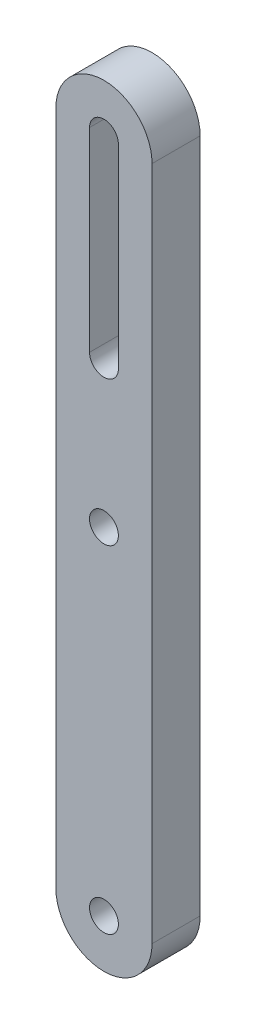
ISO-10303-21;
HEADER;
FILE_DESCRIPTION(('STEP AP214'),'2;1');
FILE_NAME('part.step','',(''),(''),'','','');
FILE_SCHEMA(('AUTOMOTIVE_DESIGN { 1 0 10303 214 1 1 1 1 }'));
ENDSEC;
DATA;
#1=APPLICATION_CONTEXT('core data for automotive mechanical design processes');
#2=APPLICATION_PROTOCOL_DEFINITION('international standard','automotive_design',2000,#1);
#3=PRODUCT_CONTEXT('',#1,'mechanical');
#4=PRODUCT('Part','Part','',(#3));
#5=PRODUCT_RELATED_PRODUCT_CATEGORY('part','',(#4));
#6=PRODUCT_DEFINITION_FORMATION('','',#4);
#7=PRODUCT_DEFINITION_CONTEXT('part definition',#1,'design');
#8=PRODUCT_DEFINITION('design','',#6,#7);
#9=PRODUCT_DEFINITION_SHAPE('','',#8);
#10=(LENGTH_UNIT() NAMED_UNIT(*) SI_UNIT(.MILLI.,.METRE.));
#11=(NAMED_UNIT(*) PLANE_ANGLE_UNIT() SI_UNIT($,.RADIAN.));
#12=(NAMED_UNIT(*) SI_UNIT($,.STERADIAN.) SOLID_ANGLE_UNIT());
#13=UNCERTAINTY_MEASURE_WITH_UNIT(LENGTH_MEASURE(1.E-05),#10,'distance_accuracy_value','');
#14=(GEOMETRIC_REPRESENTATION_CONTEXT(3) GLOBAL_UNCERTAINTY_ASSIGNED_CONTEXT((#13)) GLOBAL_UNIT_ASSIGNED_CONTEXT((#10,
#11,#12)) REPRESENTATION_CONTEXT('',''));
#15=CARTESIAN_POINT('',(0.,0.,0.));
#16=DIRECTION('',(0.,0.,1.));
#17=DIRECTION('',(1.,0.,0.));
#18=AXIS2_PLACEMENT_3D('',#15,#16,#17);
#19=CARTESIAN_POINT('',(0.,0.,5.));
#20=DIRECTION('',(0.,0.,1.));
#21=DIRECTION('',(1.,0.,0.));
#22=AXIS2_PLACEMENT_3D('',#19,#20,#21);
#23=PLANE('',#22);
#24=DIRECTION('',(0.,-1.,0.));
#25=VECTOR('',#24,1.);
#26=CARTESIAN_POINT('',(-1.5,0.,5.));
#27=LINE('',#26,#25);
#28=CARTESIAN_POINT('',(-1.49999909745678,-29.7588302171352,5.));
#29=VERTEX_POINT('',#28);
#30=CARTESIAN_POINT('',(-1.5,-50.,5.));
#31=VERTEX_POINT('',#30);
#32=EDGE_CURVE('E130',#29,#31,#27,.T.);
#33=ORIENTED_EDGE('',*,*,#32,.F.);
#34=CARTESIAN_POINT('',(9.02543215511309E-07,-29.7588302171352,5.));
#35=DIRECTION('',(0.,0.,1.));
#36=DIRECTION('',(-1.,0.,0.));
#37=AXIS2_PLACEMENT_3D('',#34,#35,#36);
#38=CIRCLE('',#37,1.5);
#39=CARTESIAN_POINT('',(1.5,-29.7604757045501,5.));
#40=VERTEX_POINT('',#39);
#41=EDGE_CURVE('E124',#40,#29,#38,.T.);
#42=ORIENTED_EDGE('',*,*,#41,.F.);
#43=DIRECTION('',(0.,1.,0.));
#44=VECTOR('',#43,1.);
#45=CARTESIAN_POINT('',(1.5,0.,5.));
#46=LINE('',#45,#44);
#47=CARTESIAN_POINT('',(1.5,-50.,5.));
#48=VERTEX_POINT('',#47);
#49=EDGE_CURVE('E107',#48,#40,#46,.T.);
#50=ORIENTED_EDGE('',*,*,#49,.F.);
#51=CARTESIAN_POINT('',(0.,-50.,5.));
#52=DIRECTION('',(0.,0.,1.));
#53=DIRECTION('',(1.,0.,0.));
#54=AXIS2_PLACEMENT_3D('',#51,#52,#53);
#55=CIRCLE('',#54,1.5);
#56=EDGE_CURVE('E117',#31,#48,#55,.T.);
#57=ORIENTED_EDGE('',*,*,#56,.F.);
#58=EDGE_LOOP('',(#33,#42,#50,#57));
#59=FACE_BOUND('',#58,.T.);
#60=CARTESIAN_POINT('',(9.02543215511309E-07,-29.7588302171352,5.));
#61=DIRECTION('',(0.,0.,-1.));
#62=DIRECTION('',(-1.,0.,0.));
#63=AXIS2_PLACEMENT_3D('',#60,#61,#62);
#64=CIRCLE('',#63,4.99999936821972);
#65=CARTESIAN_POINT('',(-4.99999846567651,-29.7588302171352,5.));
#66=VERTEX_POINT('',#65);
#67=CARTESIAN_POINT('',(5.00000000000001,-29.7604757045501,5.));
#68=VERTEX_POINT('',#67);
#69=EDGE_CURVE('E135',#66,#68,#64,.T.);
#70=ORIENTED_EDGE('',*,*,#69,.F.);
#71=DIRECTION('',(6.18896317433317E-07,0.999999999999808,0.));
#72=VECTOR('',#71,1.);
#73=CARTESIAN_POINT('',(-4.99999846567651,-29.7588302171352,5.));
#74=LINE('',#73,#72);
#75=CARTESIAN_POINT('',(-4.99999846669489,-29.7604757045506,5.));
#76=VERTEX_POINT('',#75);
#77=EDGE_CURVE('E132',#76,#66,#74,.T.);
#78=ORIENTED_EDGE('',*,*,#77,.F.);
#79=DIRECTION('',(0.,-1.,0.));
#80=VECTOR('',#79,1.);
#81=CARTESIAN_POINT('',(-5.,0.,5.));
#82=LINE('',#81,#80);
#83=CARTESIAN_POINT('',(-4.99999999999999,-100.,5.));
#84=VERTEX_POINT('',#83);
#85=EDGE_CURVE('E171',#76,#84,#82,.T.);
#86=ORIENTED_EDGE('',*,*,#85,.T.);
#87=CARTESIAN_POINT('',(0.,-100.,5.));
#88=DIRECTION('',(0.,0.,1.));
#89=DIRECTION('',(1.,0.,0.));
#90=AXIS2_PLACEMENT_3D('',#87,#88,#89);
#91=CIRCLE('',#90,5.);
#92=CARTESIAN_POINT('',(5.00000000000001,-100.,5.));
#93=VERTEX_POINT('',#92);
#94=EDGE_CURVE('E50',#84,#93,#91,.T.);
#95=ORIENTED_EDGE('',*,*,#94,.T.);
#96=DIRECTION('',(0.,1.,0.));
#97=VECTOR('',#96,1.);
#98=CARTESIAN_POINT('',(5.,0.,5.));
#99=LINE('',#98,#97);
#100=EDGE_CURVE('E175',#93,#68,#99,.T.);
#101=ORIENTED_EDGE('',*,*,#100,.T.);
#102=EDGE_LOOP('',(#70,#78,#86,#95,#101));
#103=FACE_BOUND('',#102,.T.);
#104=CARTESIAN_POINT('',(0.,-100.,5.));
#105=DIRECTION('',(0.,0.,1.));
#106=DIRECTION('',(1.,0.,0.));
#107=AXIS2_PLACEMENT_3D('',#104,#105,#106);
#108=CIRCLE('',#107,1.5);
#109=CARTESIAN_POINT('',(1.50000000000001,-100.,5.));
#110=VERTEX_POINT('',#109);
#111=EDGE_CURVE('E166',#110,#110,#108,.T.);
#112=ORIENTED_EDGE('',*,*,#111,.F.);
#113=EDGE_LOOP('',(#112));
#114=FACE_BOUND('',#113,.T.);
#115=CARTESIAN_POINT('',(0.,-65.,5.));
#116=DIRECTION('',(0.,0.,1.));
#117=DIRECTION('',(1.,0.,0.));
#118=AXIS2_PLACEMENT_3D('',#115,#116,#117);
#119=CIRCLE('',#118,1.5);
#120=CARTESIAN_POINT('',(1.50000000000001,-65.,5.));
#121=VERTEX_POINT('',#120);
#122=EDGE_CURVE('E160',#121,#121,#119,.T.);
#123=ORIENTED_EDGE('',*,*,#122,.F.);
#124=EDGE_LOOP('',(#123));
#125=FACE_BOUND('',#124,.T.);
#126=ADVANCED_FACE('F33',(#59,#103,#114,#125),#23,.T.);
#127=CARTESIAN_POINT('',(0.,0.,0.));
#128=DIRECTION('',(0.,0.,1.));
#129=DIRECTION('',(1.,0.,0.));
#130=AXIS2_PLACEMENT_3D('',#127,#128,#129);
#131=PLANE('',#130);
#132=CARTESIAN_POINT('',(9.02543215511309E-07,-29.7588302171352,0.));
#133=DIRECTION('',(0.,0.,1.));
#134=DIRECTION('',(-1.,0.,0.));
#135=AXIS2_PLACEMENT_3D('',#132,#133,#134);
#136=CIRCLE('',#135,1.5);
#137=CARTESIAN_POINT('',(1.5,-29.7604757045501,0.));
#138=VERTEX_POINT('',#137);
#139=CARTESIAN_POINT('',(-1.49999909745678,-29.7588302171352,0.));
#140=VERTEX_POINT('',#139);
#141=EDGE_CURVE('E126',#138,#140,#136,.T.);
#142=ORIENTED_EDGE('',*,*,#141,.T.);
#143=DIRECTION('',(0.,-1.,0.));
#144=VECTOR('',#143,1.);
#145=CARTESIAN_POINT('',(-1.5,0.,0.));
#146=LINE('',#145,#144);
#147=CARTESIAN_POINT('',(-1.5,-50.,0.));
#148=VERTEX_POINT('',#147);
#149=EDGE_CURVE('E154',#140,#148,#146,.T.);
#150=ORIENTED_EDGE('',*,*,#149,.T.);
#151=CARTESIAN_POINT('',(0.,-50.,0.));
#152=DIRECTION('',(0.,0.,1.));
#153=DIRECTION('',(1.,0.,0.));
#154=AXIS2_PLACEMENT_3D('',#151,#152,#153);
#155=CIRCLE('',#154,1.5);
#156=CARTESIAN_POINT('',(1.5,-50.,0.));
#157=VERTEX_POINT('',#156);
#158=EDGE_CURVE('E11',#148,#157,#155,.T.);
#159=ORIENTED_EDGE('',*,*,#158,.T.);
#160=DIRECTION('',(0.,1.,0.));
#161=VECTOR('',#160,1.);
#162=CARTESIAN_POINT('',(1.5,0.,0.));
#163=LINE('',#162,#161);
#164=EDGE_CURVE('E70',#157,#138,#163,.T.);
#165=ORIENTED_EDGE('',*,*,#164,.T.);
#166=EDGE_LOOP('',(#142,#150,#159,#165));
#167=FACE_BOUND('',#166,.T.);
#168=CARTESIAN_POINT('',(0.,-100.,0.));
#169=DIRECTION('',(0.,0.,1.));
#170=DIRECTION('',(1.,0.,0.));
#171=AXIS2_PLACEMENT_3D('',#168,#169,#170);
#172=CIRCLE('',#171,1.5);
#173=CARTESIAN_POINT('',(1.50000000000001,-100.,0.));
#174=VERTEX_POINT('',#173);
#175=EDGE_CURVE('E163',#174,#174,#172,.T.);
#176=ORIENTED_EDGE('',*,*,#175,.T.);
#177=EDGE_LOOP('',(#176));
#178=FACE_BOUND('',#177,.T.);
#179=DIRECTION('',(6.18896317433317E-07,0.999999999999808,0.));
#180=VECTOR('',#179,1.);
#181=CARTESIAN_POINT('',(-4.99999846567651,-29.7588302171352,0.));
#182=LINE('',#181,#180);
#183=CARTESIAN_POINT('',(-4.99999846669489,-29.7604757045506,0.));
#184=VERTEX_POINT('',#183);
#185=CARTESIAN_POINT('',(-4.99999846567651,-29.7588302171352,0.));
#186=VERTEX_POINT('',#185);
#187=EDGE_CURVE('E138',#184,#186,#182,.T.);
#188=ORIENTED_EDGE('',*,*,#187,.T.);
#189=CARTESIAN_POINT('',(9.02543215511309E-07,-29.7588302171352,0.));
#190=DIRECTION('',(0.,0.,-1.));
#191=DIRECTION('',(-1.,0.,0.));
#192=AXIS2_PLACEMENT_3D('',#189,#190,#191);
#193=CIRCLE('',#192,4.99999936821972);
#194=CARTESIAN_POINT('',(5.00000000000001,-29.7604757045501,0.));
#195=VERTEX_POINT('',#194);
#196=EDGE_CURVE('E133',#186,#195,#193,.T.);
#197=ORIENTED_EDGE('',*,*,#196,.T.);
#198=DIRECTION('',(0.,1.,0.));
#199=VECTOR('',#198,1.);
#200=CARTESIAN_POINT('',(5.,0.,0.));
#201=LINE('',#200,#199);
#202=CARTESIAN_POINT('',(5.00000000000001,-100.,0.));
#203=VERTEX_POINT('',#202);
#204=EDGE_CURVE('E173',#203,#195,#201,.T.);
#205=ORIENTED_EDGE('',*,*,#204,.F.);
#206=CARTESIAN_POINT('',(0.,-100.,0.));
#207=DIRECTION('',(0.,0.,1.));
#208=DIRECTION('',(1.,0.,0.));
#209=AXIS2_PLACEMENT_3D('',#206,#207,#208);
#210=CIRCLE('',#209,5.);
#211=CARTESIAN_POINT('',(-4.99999999999999,-100.,0.));
#212=VERTEX_POINT('',#211);
#213=EDGE_CURVE('E179',#212,#203,#210,.T.);
#214=ORIENTED_EDGE('',*,*,#213,.F.);
#215=DIRECTION('',(0.,-1.,0.));
#216=VECTOR('',#215,1.);
#217=CARTESIAN_POINT('',(-5.,0.,0.));
#218=LINE('',#217,#216);
#219=EDGE_CURVE('E61',#184,#212,#218,.T.);
#220=ORIENTED_EDGE('',*,*,#219,.F.);
#221=EDGE_LOOP('',(#188,#197,#205,#214,#220));
#222=FACE_BOUND('',#221,.T.);
#223=CARTESIAN_POINT('',(0.,-65.,0.));
#224=DIRECTION('',(0.,0.,1.));
#225=DIRECTION('',(1.,0.,0.));
#226=AXIS2_PLACEMENT_3D('',#223,#224,#225);
#227=CIRCLE('',#226,1.5);
#228=CARTESIAN_POINT('',(1.50000000000001,-65.,0.));
#229=VERTEX_POINT('',#228);
#230=EDGE_CURVE('E159',#229,#229,#227,.T.);
#231=ORIENTED_EDGE('',*,*,#230,.T.);
#232=EDGE_LOOP('',(#231));
#233=FACE_BOUND('',#232,.T.);
#234=ADVANCED_FACE('F189',(#167,#178,#222,#233),#131,.F.);
#235=CARTESIAN_POINT('',(-5.,0.,5.));
#236=DIRECTION('',(1.,0.,0.));
#237=DIRECTION('',(0.,1.,0.));
#238=AXIS2_PLACEMENT_3D('',#235,#236,#237);
#239=PLANE('',#238);
#240=DIRECTION('',(0.,0.,-1.));
#241=VECTOR('',#240,1.);
#242=CARTESIAN_POINT('',(-4.99999999999999,-100.,5.));
#243=LINE('',#242,#241);
#244=EDGE_CURVE('E42',#84,#212,#243,.T.);
#245=ORIENTED_EDGE('',*,*,#244,.F.);
#246=ORIENTED_EDGE('',*,*,#85,.F.);
#247=ORIENTED_EDGE('',*,*,#77,.T.);
#248=DIRECTION('',(0.,0.,-1.));
#249=VECTOR('',#248,1.);
#250=CARTESIAN_POINT('',(-4.99999846567651,-29.7588302171352,5.));
#251=LINE('',#250,#249);
#252=EDGE_CURVE('E128',#66,#186,#251,.T.);
#253=ORIENTED_EDGE('',*,*,#252,.T.);
#254=ORIENTED_EDGE('',*,*,#187,.F.);
#255=ORIENTED_EDGE('',*,*,#219,.T.);
#256=EDGE_LOOP('',(#245,#246,#247,#253,#254,#255));
#257=FACE_BOUND('',#256,.T.);
#258=ADVANCED_FACE('F35',(#257),#239,.F.);
#259=CARTESIAN_POINT('',(0.,-100.,5.));
#260=DIRECTION('',(0.,0.,-1.));
#261=DIRECTION('',(-1.,0.,0.));
#262=AXIS2_PLACEMENT_3D('',#259,#260,#261);
#263=CYLINDRICAL_SURFACE('',#262,5.);
#264=ORIENTED_EDGE('',*,*,#213,.T.);
#265=DIRECTION('',(0.,0.,-1.));
#266=VECTOR('',#265,1.);
#267=CARTESIAN_POINT('',(5.00000000000001,-100.,5.));
#268=LINE('',#267,#266);
#269=EDGE_CURVE('E177',#93,#203,#268,.T.);
#270=ORIENTED_EDGE('',*,*,#269,.F.);
#271=ORIENTED_EDGE('',*,*,#94,.F.);
#272=ORIENTED_EDGE('',*,*,#244,.T.);
#273=EDGE_LOOP('',(#264,#270,#271,#272));
#274=FACE_BOUND('',#273,.T.);
#275=ADVANCED_FACE('F185',(#274),#263,.T.);
#276=CARTESIAN_POINT('',(5.,0.,5.));
#277=DIRECTION('',(-1.,0.,0.));
#278=DIRECTION('',(0.,-1.,0.));
#279=AXIS2_PLACEMENT_3D('',#276,#277,#278);
#280=PLANE('',#279);
#281=ORIENTED_EDGE('',*,*,#204,.T.);
#282=DIRECTION('',(0.,0.,1.));
#283=VECTOR('',#282,1.);
#284=CARTESIAN_POINT('',(5.,-29.7604757045501,5.));
#285=LINE('',#284,#283);
#286=EDGE_CURVE('E127',#195,#68,#285,.T.);
#287=ORIENTED_EDGE('',*,*,#286,.T.);
#288=ORIENTED_EDGE('',*,*,#100,.F.);
#289=ORIENTED_EDGE('',*,*,#269,.T.);
#290=EDGE_LOOP('',(#281,#287,#288,#289));
#291=FACE_BOUND('',#290,.T.);
#292=ADVANCED_FACE('F194',(#291),#280,.F.);
#293=CARTESIAN_POINT('',(0.,-100.,5.));
#294=DIRECTION('',(0.,0.,-1.));
#295=DIRECTION('',(-1.,0.,0.));
#296=AXIS2_PLACEMENT_3D('',#293,#294,#295);
#297=CYLINDRICAL_SURFACE('',#296,1.5);
#298=ORIENTED_EDGE('',*,*,#111,.T.);
#299=EDGE_LOOP('',(#298));
#300=FACE_BOUND('',#299,.T.);
#301=ORIENTED_EDGE('',*,*,#175,.F.);
#302=EDGE_LOOP('',(#301));
#303=FACE_BOUND('',#302,.T.);
#304=ADVANCED_FACE('F215',(#300,#303),#297,.F.);
#305=CARTESIAN_POINT('',(0.,-65.,5.));
#306=DIRECTION('',(0.,0.,-1.));
#307=DIRECTION('',(-1.,0.,0.));
#308=AXIS2_PLACEMENT_3D('',#305,#306,#307);
#309=CYLINDRICAL_SURFACE('',#308,1.5);
#310=ORIENTED_EDGE('',*,*,#122,.T.);
#311=EDGE_LOOP('',(#310));
#312=FACE_BOUND('',#311,.T.);
#313=ORIENTED_EDGE('',*,*,#230,.F.);
#314=EDGE_LOOP('',(#313));
#315=FACE_BOUND('',#314,.T.);
#316=ADVANCED_FACE('F223',(#312,#315),#309,.F.);
#317=CARTESIAN_POINT('',(0.,-50.,-5.));
#318=DIRECTION('',(0.,0.,1.));
#319=DIRECTION('',(1.,0.,0.));
#320=AXIS2_PLACEMENT_3D('',#317,#318,#319);
#321=CYLINDRICAL_SURFACE('',#320,1.5);
#322=DIRECTION('',(0.,0.,1.));
#323=VECTOR('',#322,1.);
#324=CARTESIAN_POINT('',(-1.5,-50.,-5.));
#325=LINE('',#324,#323);
#326=EDGE_CURVE('E116',#148,#31,#325,.T.);
#327=ORIENTED_EDGE('',*,*,#326,.T.);
#328=ORIENTED_EDGE('',*,*,#56,.T.);
#329=DIRECTION('',(0.,0.,1.));
#330=VECTOR('',#329,1.);
#331=CARTESIAN_POINT('',(1.5,-50.,-5.));
#332=LINE('',#331,#330);
#333=EDGE_CURVE('E111',#157,#48,#332,.T.);
#334=ORIENTED_EDGE('',*,*,#333,.F.);
#335=ORIENTED_EDGE('',*,*,#158,.F.);
#336=EDGE_LOOP('',(#327,#328,#334,#335));
#337=FACE_BOUND('',#336,.T.);
#338=ADVANCED_FACE('F228',(#337),#321,.F.);
#339=CARTESIAN_POINT('',(1.5,0.,-5.));
#340=DIRECTION('',(1.,0.,0.));
#341=DIRECTION('',(0.,1.,0.));
#342=AXIS2_PLACEMENT_3D('',#339,#340,#341);
#343=PLANE('',#342);
#344=ORIENTED_EDGE('',*,*,#49,.T.);
#345=DIRECTION('',(0.,0.,-1.));
#346=VECTOR('',#345,1.);
#347=CARTESIAN_POINT('',(1.5,-29.7604757045501,-5.));
#348=LINE('',#347,#346);
#349=EDGE_CURVE('E110',#40,#138,#348,.T.);
#350=ORIENTED_EDGE('',*,*,#349,.T.);
#351=ORIENTED_EDGE('',*,*,#164,.F.);
#352=ORIENTED_EDGE('',*,*,#333,.T.);
#353=EDGE_LOOP('',(#344,#350,#351,#352));
#354=FACE_BOUND('',#353,.T.);
#355=ADVANCED_FACE('F109',(#354),#343,.F.);
#356=CARTESIAN_POINT('',(-1.5,0.,-5.));
#357=DIRECTION('',(-1.,0.,0.));
#358=DIRECTION('',(0.,-1.,0.));
#359=AXIS2_PLACEMENT_3D('',#356,#357,#358);
#360=PLANE('',#359);
#361=ORIENTED_EDGE('',*,*,#326,.F.);
#362=ORIENTED_EDGE('',*,*,#149,.F.);
#363=DIRECTION('',(0.,0.,-1.));
#364=VECTOR('',#363,1.);
#365=CARTESIAN_POINT('',(-1.49999909745678,-29.7588302171352,5.));
#366=LINE('',#365,#364);
#367=EDGE_CURVE('E143',#29,#140,#366,.T.);
#368=ORIENTED_EDGE('',*,*,#367,.F.);
#369=ORIENTED_EDGE('',*,*,#32,.T.);
#370=EDGE_LOOP('',(#361,#362,#368,#369));
#371=FACE_BOUND('',#370,.T.);
#372=ADVANCED_FACE('F244',(#371),#360,.F.);
#373=CARTESIAN_POINT('',(9.02543215511309E-07,-29.7588302171352,5.));
#374=DIRECTION('',(0.,0.,-1.));
#375=DIRECTION('',(-1.,0.,0.));
#376=AXIS2_PLACEMENT_3D('',#373,#374,#375);
#377=CYLINDRICAL_SURFACE('',#376,4.99999936821972);
#378=ORIENTED_EDGE('',*,*,#196,.F.);
#379=ORIENTED_EDGE('',*,*,#252,.F.);
#380=ORIENTED_EDGE('',*,*,#69,.T.);
#381=ORIENTED_EDGE('',*,*,#286,.F.);
#382=EDGE_LOOP('',(#378,#379,#380,#381));
#383=FACE_BOUND('',#382,.T.);
#384=ADVANCED_FACE('F200',(#383),#377,.T.);
#385=CARTESIAN_POINT('',(9.02543215511309E-07,-29.7588302171352,5.));
#386=DIRECTION('',(0.,0.,-1.));
#387=DIRECTION('',(-1.,0.,0.));
#388=AXIS2_PLACEMENT_3D('',#385,#386,#387);
#389=CYLINDRICAL_SURFACE('',#388,1.5);
#390=ORIENTED_EDGE('',*,*,#141,.F.);
#391=ORIENTED_EDGE('',*,*,#349,.F.);
#392=ORIENTED_EDGE('',*,*,#41,.T.);
#393=ORIENTED_EDGE('',*,*,#367,.T.);
#394=EDGE_LOOP('',(#390,#391,#392,#393));
#395=FACE_BOUND('',#394,.T.);
#396=ADVANCED_FACE('F122',(#395),#389,.F.);
#397=CLOSED_SHELL('',(#126,#234,#258,#275,#292,#304,#316,#338,#355,#372,#384,#396));
#398=MANIFOLD_SOLID_BREP('B2',#397);
#399=ADVANCED_BREP_SHAPE_REPRESENTATION('',(#18,#398),#14);
#400=SHAPE_DEFINITION_REPRESENTATION(#9,#399);
ENDSEC;
END-ISO-10303-21;
